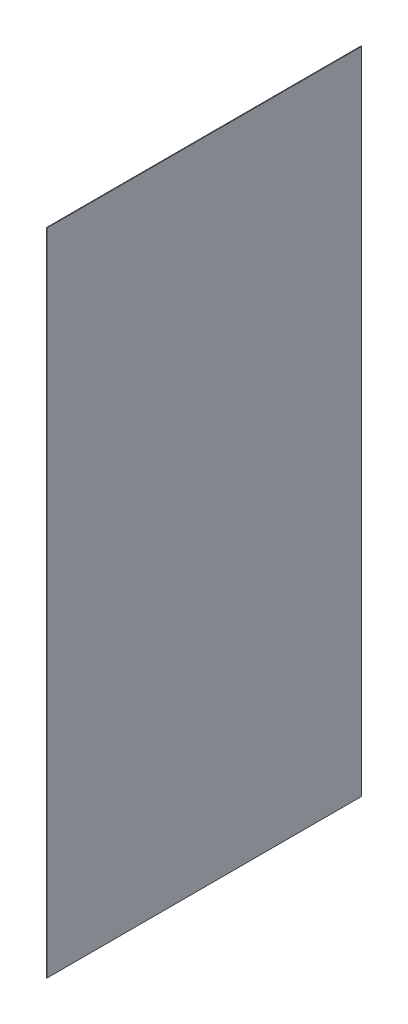
ISO-10303-21;
HEADER;
FILE_DESCRIPTION(('STEP AP214'),'2;1');
FILE_NAME('part.step','',(''),(''),'','','');
FILE_SCHEMA(('AUTOMOTIVE_DESIGN { 1 0 10303 214 1 1 1 1 }'));
ENDSEC;
DATA;
#1=APPLICATION_CONTEXT('core data for automotive mechanical design processes');
#2=APPLICATION_PROTOCOL_DEFINITION('international standard','automotive_design',2000,#1);
#3=PRODUCT_CONTEXT('',#1,'mechanical');
#4=PRODUCT('Part','Part','',(#3));
#5=PRODUCT_RELATED_PRODUCT_CATEGORY('part','',(#4));
#6=PRODUCT_DEFINITION_FORMATION('','',#4);
#7=PRODUCT_DEFINITION_CONTEXT('part definition',#1,'design');
#8=PRODUCT_DEFINITION('design','',#6,#7);
#9=PRODUCT_DEFINITION_SHAPE('','',#8);
#10=(LENGTH_UNIT() NAMED_UNIT(*) SI_UNIT(.MILLI.,.METRE.));
#11=(NAMED_UNIT(*) PLANE_ANGLE_UNIT() SI_UNIT($,.RADIAN.));
#12=(NAMED_UNIT(*) SI_UNIT($,.STERADIAN.) SOLID_ANGLE_UNIT());
#13=UNCERTAINTY_MEASURE_WITH_UNIT(LENGTH_MEASURE(1.E-05),#10,'distance_accuracy_value','');
#14=(GEOMETRIC_REPRESENTATION_CONTEXT(3) GLOBAL_UNCERTAINTY_ASSIGNED_CONTEXT((#13)) GLOBAL_UNIT_ASSIGNED_CONTEXT((#10,
#11,#12)) REPRESENTATION_CONTEXT('',''));
#15=CARTESIAN_POINT('',(0.,0.,0.));
#16=DIRECTION('',(0.,0.,1.));
#17=DIRECTION('',(1.,0.,0.));
#18=AXIS2_PLACEMENT_3D('',#15,#16,#17);
#19=CARTESIAN_POINT('',(3.175,3504.13943968538,32.8621372290679));
#20=DIRECTION('',(0.,0.,-1.));
#21=DIRECTION('',(0.,1.,0.));
#22=AXIS2_PLACEMENT_3D('',#19,#20,#21);
#23=PLANE('',#22);
#24=DIRECTION('',(0.,-1.,0.));
#25=VECTOR('',#24,1.);
#26=CARTESIAN_POINT('',(0.,3504.13943968538,32.8621372290679));
#27=LINE('',#26,#25);
#28=CARTESIAN_POINT('',(0.,3504.13943968538,32.8621372290679));
#29=VERTEX_POINT('',#28);
#30=CARTESIAN_POINT('',(0.,-51.8605603146222,32.8621372290675));
#31=VERTEX_POINT('',#30);
#32=EDGE_CURVE('E96',#29,#31,#27,.T.);
#33=ORIENTED_EDGE('',*,*,#32,.T.);
#34=DIRECTION('',(-1.,0.,0.));
#35=VECTOR('',#34,1.);
#36=CARTESIAN_POINT('',(3.175,-51.8605603146222,32.8621372290675));
#37=LINE('',#36,#35);
#38=CARTESIAN_POINT('',(3.175,-51.8605603146222,32.8621372290675));
#39=VERTEX_POINT('',#38);
#40=EDGE_CURVE('E11',#39,#31,#37,.T.);
#41=ORIENTED_EDGE('',*,*,#40,.F.);
#42=DIRECTION('',(0.,-1.,0.));
#43=VECTOR('',#42,1.);
#44=CARTESIAN_POINT('',(3.175,3504.13943968538,32.8621372290679));
#45=LINE('',#44,#43);
#46=CARTESIAN_POINT('',(3.175,3504.13943968538,32.8621372290679));
#47=VERTEX_POINT('',#46);
#48=EDGE_CURVE('E84',#47,#39,#45,.T.);
#49=ORIENTED_EDGE('',*,*,#48,.F.);
#50=DIRECTION('',(-1.,0.,0.));
#51=VECTOR('',#50,1.);
#52=CARTESIAN_POINT('',(3.175,3504.13943968538,32.8621372290679));
#53=LINE('',#52,#51);
#54=EDGE_CURVE('E92',#47,#29,#53,.T.);
#55=ORIENTED_EDGE('',*,*,#54,.T.);
#56=EDGE_LOOP('',(#33,#41,#49,#55));
#57=FACE_BOUND('',#56,.T.);
#58=ADVANCED_FACE('F33',(#57),#23,.F.);
#59=CARTESIAN_POINT('',(3.175,-51.8605603146222,32.8621372290675));
#60=DIRECTION('',(0.,1.,0.));
#61=DIRECTION('',(0.,0.,1.));
#62=AXIS2_PLACEMENT_3D('',#59,#60,#61);
#63=PLANE('',#62);
#64=DIRECTION('',(0.,0.,-1.));
#65=VECTOR('',#64,1.);
#66=CARTESIAN_POINT('',(0.,-51.8605603146222,32.8621372290675));
#67=LINE('',#66,#65);
#68=CARTESIAN_POINT('',(0.,-51.8605603146222,-1687.98786277093));
#69=VERTEX_POINT('',#68);
#70=EDGE_CURVE('E88',#31,#69,#67,.T.);
#71=ORIENTED_EDGE('',*,*,#70,.T.);
#72=DIRECTION('',(-1.,0.,0.));
#73=VECTOR('',#72,1.);
#74=CARTESIAN_POINT('',(3.175,-51.8605603146222,-1687.98786277093));
#75=LINE('',#74,#73);
#76=CARTESIAN_POINT('',(3.175,-51.8605603146222,-1687.98786277093));
#77=VERTEX_POINT('',#76);
#78=EDGE_CURVE('E41',#77,#69,#75,.T.);
#79=ORIENTED_EDGE('',*,*,#78,.F.);
#80=DIRECTION('',(0.,0.,-1.));
#81=VECTOR('',#80,1.);
#82=CARTESIAN_POINT('',(3.175,-51.8605603146222,32.8621372290675));
#83=LINE('',#82,#81);
#84=EDGE_CURVE('E79',#39,#77,#83,.T.);
#85=ORIENTED_EDGE('',*,*,#84,.F.);
#86=ORIENTED_EDGE('',*,*,#40,.T.);
#87=EDGE_LOOP('',(#71,#79,#85,#86));
#88=FACE_BOUND('',#87,.T.);
#89=ADVANCED_FACE('F87',(#88),#63,.F.);
#90=CARTESIAN_POINT('',(3.175,3504.13943968538,-1687.98786277093));
#91=DIRECTION('',(0.,0.,1.));
#92=DIRECTION('',(0.,-1.,0.));
#93=AXIS2_PLACEMENT_3D('',#90,#91,#92);
#94=PLANE('',#93);
#95=DIRECTION('',(0.,1.,0.));
#96=VECTOR('',#95,1.);
#97=CARTESIAN_POINT('',(0.,3504.13943968538,-1687.98786277093));
#98=LINE('',#97,#96);
#99=CARTESIAN_POINT('',(0.,3504.13943968538,-1687.98786277093));
#100=VERTEX_POINT('',#99);
#101=EDGE_CURVE('E66',#69,#100,#98,.T.);
#102=ORIENTED_EDGE('',*,*,#101,.T.);
#103=DIRECTION('',(-1.,0.,0.));
#104=VECTOR('',#103,1.);
#105=CARTESIAN_POINT('',(3.175,3504.13943968538,-1687.98786277093));
#106=LINE('',#105,#104);
#107=CARTESIAN_POINT('',(3.175,3504.13943968538,-1687.98786277093));
#108=VERTEX_POINT('',#107);
#109=EDGE_CURVE('E89',#108,#100,#106,.T.);
#110=ORIENTED_EDGE('',*,*,#109,.F.);
#111=DIRECTION('',(0.,1.,0.));
#112=VECTOR('',#111,1.);
#113=CARTESIAN_POINT('',(3.175,3504.13943968538,-1687.98786277093));
#114=LINE('',#113,#112);
#115=EDGE_CURVE('E82',#77,#108,#114,.T.);
#116=ORIENTED_EDGE('',*,*,#115,.F.);
#117=ORIENTED_EDGE('',*,*,#78,.T.);
#118=EDGE_LOOP('',(#102,#110,#116,#117));
#119=FACE_BOUND('',#118,.T.);
#120=ADVANCED_FACE('F90',(#119),#94,.F.);
#121=CARTESIAN_POINT('',(3.175,3504.13943968538,32.8621372290679));
#122=DIRECTION('',(0.,-1.,0.));
#123=DIRECTION('',(0.,0.,-1.));
#124=AXIS2_PLACEMENT_3D('',#121,#122,#123);
#125=PLANE('',#124);
#126=DIRECTION('',(0.,0.,1.));
#127=VECTOR('',#126,1.);
#128=CARTESIAN_POINT('',(0.,3504.13943968538,32.8621372290679));
#129=LINE('',#128,#127);
#130=EDGE_CURVE('E72',#100,#29,#129,.T.);
#131=ORIENTED_EDGE('',*,*,#130,.T.);
#132=ORIENTED_EDGE('',*,*,#54,.F.);
#133=DIRECTION('',(0.,0.,1.));
#134=VECTOR('',#133,1.);
#135=CARTESIAN_POINT('',(3.175,3504.13943968538,32.8621372290679));
#136=LINE('',#135,#134);
#137=EDGE_CURVE('E49',#108,#47,#136,.T.);
#138=ORIENTED_EDGE('',*,*,#137,.F.);
#139=ORIENTED_EDGE('',*,*,#109,.T.);
#140=EDGE_LOOP('',(#131,#132,#138,#139));
#141=FACE_BOUND('',#140,.T.);
#142=ADVANCED_FACE('F103',(#141),#125,.F.);
#143=CARTESIAN_POINT('',(3.175,-51.8605603146222,32.8621372290675));
#144=DIRECTION('',(1.,0.,0.));
#145=DIRECTION('',(0.,0.,-1.));
#146=AXIS2_PLACEMENT_3D('',#143,#144,#145);
#147=PLANE('',#146);
#148=ORIENTED_EDGE('',*,*,#48,.T.);
#149=ORIENTED_EDGE('',*,*,#84,.T.);
#150=ORIENTED_EDGE('',*,*,#115,.T.);
#151=ORIENTED_EDGE('',*,*,#137,.T.);
#152=EDGE_LOOP('',(#148,#149,#150,#151));
#153=FACE_BOUND('',#152,.T.);
#154=ADVANCED_FACE('F80',(#153),#147,.T.);
#155=CARTESIAN_POINT('',(0.,-51.8605603146222,32.8621372290675));
#156=DIRECTION('',(1.,0.,0.));
#157=DIRECTION('',(0.,0.,-1.));
#158=AXIS2_PLACEMENT_3D('',#155,#156,#157);
#159=PLANE('',#158);
#160=ORIENTED_EDGE('',*,*,#32,.F.);
#161=ORIENTED_EDGE('',*,*,#130,.F.);
#162=ORIENTED_EDGE('',*,*,#101,.F.);
#163=ORIENTED_EDGE('',*,*,#70,.F.);
#164=EDGE_LOOP('',(#160,#161,#162,#163));
#165=FACE_BOUND('',#164,.T.);
#166=ADVANCED_FACE('F106',(#165),#159,.F.);
#167=CLOSED_SHELL('',(#58,#89,#120,#142,#154,#166));
#168=MANIFOLD_SOLID_BREP('B2',#167);
#169=ADVANCED_BREP_SHAPE_REPRESENTATION('',(#18,#168),#14);
#170=SHAPE_DEFINITION_REPRESENTATION(#9,#169);
ENDSEC;
END-ISO-10303-21;
